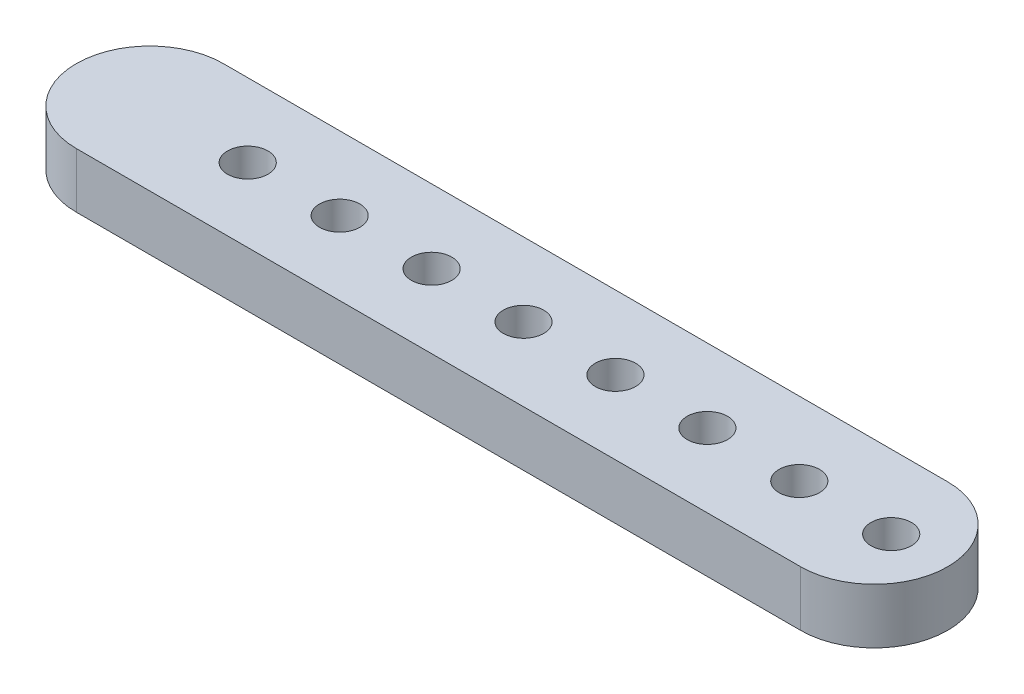
ISO-10303-21;
HEADER;
FILE_DESCRIPTION(('STEP AP214'),'2;1');
FILE_NAME('part.step','',(''),(''),'','','');
FILE_SCHEMA(('AUTOMOTIVE_DESIGN { 1 0 10303 214 1 1 1 1 }'));
ENDSEC;
DATA;
#1=APPLICATION_CONTEXT('core data for automotive mechanical design processes');
#2=APPLICATION_PROTOCOL_DEFINITION('international standard','automotive_design',2000,#1);
#3=PRODUCT_CONTEXT('',#1,'mechanical');
#4=PRODUCT('Part','Part','',(#3));
#5=PRODUCT_RELATED_PRODUCT_CATEGORY('part','',(#4));
#6=PRODUCT_DEFINITION_FORMATION('','',#4);
#7=PRODUCT_DEFINITION_CONTEXT('part definition',#1,'design');
#8=PRODUCT_DEFINITION('design','',#6,#7);
#9=PRODUCT_DEFINITION_SHAPE('','',#8);
#10=(LENGTH_UNIT() NAMED_UNIT(*) SI_UNIT(.MILLI.,.METRE.));
#11=(NAMED_UNIT(*) PLANE_ANGLE_UNIT() SI_UNIT($,.RADIAN.));
#12=(NAMED_UNIT(*) SI_UNIT($,.STERADIAN.) SOLID_ANGLE_UNIT());
#13=UNCERTAINTY_MEASURE_WITH_UNIT(LENGTH_MEASURE(1.E-05),#10,'distance_accuracy_value','');
#14=(GEOMETRIC_REPRESENTATION_CONTEXT(3) GLOBAL_UNCERTAINTY_ASSIGNED_CONTEXT((#13)) GLOBAL_UNIT_ASSIGNED_CONTEXT((#10,
#11,#12)) REPRESENTATION_CONTEXT('',''));
#15=CARTESIAN_POINT('',(0.,0.,0.));
#16=DIRECTION('',(0.,0.,1.));
#17=DIRECTION('',(1.,0.,0.));
#18=AXIS2_PLACEMENT_3D('',#15,#16,#17);
#19=CARTESIAN_POINT('',(44.3166906363032,2.625,0.));
#20=DIRECTION('',(0.,-1.,0.));
#21=DIRECTION('',(0.,0.,-1.));
#22=AXIS2_PLACEMENT_3D('',#19,#20,#21);
#23=CYLINDRICAL_SURFACE('',#22,5.);
#24=CARTESIAN_POINT('',(44.3166906363032,-1.125,0.));
#25=DIRECTION('',(0.,1.,0.));
#26=DIRECTION('',(0.,0.,1.));
#27=AXIS2_PLACEMENT_3D('',#24,#25,#26);
#28=CIRCLE('',#27,5.);
#29=CARTESIAN_POINT('',(44.3166906363032,-1.125,-5.));
#30=VERTEX_POINT('',#29);
#31=CARTESIAN_POINT('',(44.3166906363032,-1.125,5.00000000000001));
#32=VERTEX_POINT('',#31);
#33=EDGE_CURVE('E98',#30,#32,#28,.T.);
#34=ORIENTED_EDGE('',*,*,#33,.T.);
#35=DIRECTION('',(0.,-1.,0.));
#36=VECTOR('',#35,1.);
#37=CARTESIAN_POINT('',(44.3166906363032,2.625,5.00000000000001));
#38=LINE('',#37,#36);
#39=CARTESIAN_POINT('',(44.3166906363032,2.625,5.00000000000001));
#40=VERTEX_POINT('',#39);
#41=EDGE_CURVE('E11',#40,#32,#38,.T.);
#42=ORIENTED_EDGE('',*,*,#41,.F.);
#43=CARTESIAN_POINT('',(44.3166906363032,2.625,0.));
#44=DIRECTION('',(0.,1.,0.));
#45=DIRECTION('',(0.,0.,1.));
#46=AXIS2_PLACEMENT_3D('',#43,#44,#45);
#47=CIRCLE('',#46,5.);
#48=CARTESIAN_POINT('',(44.3166906363032,2.625,-5.));
#49=VERTEX_POINT('',#48);
#50=EDGE_CURVE('E86',#49,#40,#47,.T.);
#51=ORIENTED_EDGE('',*,*,#50,.F.);
#52=DIRECTION('',(0.,-1.,0.));
#53=VECTOR('',#52,1.);
#54=CARTESIAN_POINT('',(44.3166906363032,2.625,-5.));
#55=LINE('',#54,#53);
#56=EDGE_CURVE('E94',#49,#30,#55,.T.);
#57=ORIENTED_EDGE('',*,*,#56,.T.);
#58=EDGE_LOOP('',(#34,#42,#51,#57));
#59=FACE_BOUND('',#58,.T.);
#60=ADVANCED_FACE('F35',(#59),#23,.T.);
#61=CARTESIAN_POINT('',(44.3166906363032,2.625,5.00000000000001));
#62=DIRECTION('',(0.,0.,-1.));
#63=DIRECTION('',(-1.,0.,0.));
#64=AXIS2_PLACEMENT_3D('',#61,#62,#63);
#65=PLANE('',#64);
#66=DIRECTION('',(1.,0.,0.));
#67=VECTOR('',#66,1.);
#68=CARTESIAN_POINT('',(44.3166906363032,-1.125,5.00000000000001));
#69=LINE('',#68,#67);
#70=CARTESIAN_POINT('',(93.5666906363032,-1.125,5.00000000000001));
#71=VERTEX_POINT('',#70);
#72=EDGE_CURVE('E90',#32,#71,#69,.T.);
#73=ORIENTED_EDGE('',*,*,#72,.T.);
#74=DIRECTION('',(0.,-1.,0.));
#75=VECTOR('',#74,1.);
#76=CARTESIAN_POINT('',(93.5666906363032,2.625,5.00000000000001));
#77=LINE('',#76,#75);
#78=CARTESIAN_POINT('',(93.5666906363032,2.625,5.00000000000001));
#79=VERTEX_POINT('',#78);
#80=EDGE_CURVE('E43',#79,#71,#77,.T.);
#81=ORIENTED_EDGE('',*,*,#80,.F.);
#82=DIRECTION('',(1.,0.,0.));
#83=VECTOR('',#82,1.);
#84=CARTESIAN_POINT('',(44.3166906363032,2.625,5.00000000000001));
#85=LINE('',#84,#83);
#86=EDGE_CURVE('E81',#40,#79,#85,.T.);
#87=ORIENTED_EDGE('',*,*,#86,.F.);
#88=ORIENTED_EDGE('',*,*,#41,.T.);
#89=EDGE_LOOP('',(#73,#81,#87,#88));
#90=FACE_BOUND('',#89,.T.);
#91=ADVANCED_FACE('F89',(#90),#65,.F.);
#92=CARTESIAN_POINT('',(93.5666906363032,2.625,0.));
#93=DIRECTION('',(0.,-1.,0.));
#94=DIRECTION('',(0.,0.,-1.));
#95=AXIS2_PLACEMENT_3D('',#92,#93,#94);
#96=CYLINDRICAL_SURFACE('',#95,5.);
#97=CARTESIAN_POINT('',(93.5666906363032,-1.125,0.));
#98=DIRECTION('',(0.,1.,0.));
#99=DIRECTION('',(0.,0.,1.));
#100=AXIS2_PLACEMENT_3D('',#97,#98,#99);
#101=CIRCLE('',#100,5.);
#102=CARTESIAN_POINT('',(93.5666906363032,-1.125,-5.));
#103=VERTEX_POINT('',#102);
#104=EDGE_CURVE('E68',#71,#103,#101,.T.);
#105=ORIENTED_EDGE('',*,*,#104,.T.);
#106=DIRECTION('',(0.,-1.,0.));
#107=VECTOR('',#106,1.);
#108=CARTESIAN_POINT('',(93.5666906363032,2.625,-5.));
#109=LINE('',#108,#107);
#110=CARTESIAN_POINT('',(93.5666906363032,2.625,-5.));
#111=VERTEX_POINT('',#110);
#112=EDGE_CURVE('E91',#111,#103,#109,.T.);
#113=ORIENTED_EDGE('',*,*,#112,.F.);
#114=CARTESIAN_POINT('',(93.5666906363032,2.625,0.));
#115=DIRECTION('',(0.,1.,0.));
#116=DIRECTION('',(0.,0.,1.));
#117=AXIS2_PLACEMENT_3D('',#114,#115,#116);
#118=CIRCLE('',#117,5.);
#119=EDGE_CURVE('E84',#79,#111,#118,.T.);
#120=ORIENTED_EDGE('',*,*,#119,.F.);
#121=ORIENTED_EDGE('',*,*,#80,.T.);
#122=EDGE_LOOP('',(#105,#113,#120,#121));
#123=FACE_BOUND('',#122,.T.);
#124=ADVANCED_FACE('F92',(#123),#96,.T.);
#125=CARTESIAN_POINT('',(44.3166906363032,2.625,-5.));
#126=DIRECTION('',(0.,0.,1.));
#127=DIRECTION('',(1.,0.,0.));
#128=AXIS2_PLACEMENT_3D('',#125,#126,#127);
#129=PLANE('',#128);
#130=DIRECTION('',(-1.,0.,0.));
#131=VECTOR('',#130,1.);
#132=CARTESIAN_POINT('',(44.3166906363032,-1.125,-5.));
#133=LINE('',#132,#131);
#134=EDGE_CURVE('E74',#103,#30,#133,.T.);
#135=ORIENTED_EDGE('',*,*,#134,.T.);
#136=ORIENTED_EDGE('',*,*,#56,.F.);
#137=DIRECTION('',(-1.,0.,0.));
#138=VECTOR('',#137,1.);
#139=CARTESIAN_POINT('',(44.3166906363032,2.625,-5.));
#140=LINE('',#139,#138);
#141=EDGE_CURVE('E51',#111,#49,#140,.T.);
#142=ORIENTED_EDGE('',*,*,#141,.F.);
#143=ORIENTED_EDGE('',*,*,#112,.T.);
#144=EDGE_LOOP('',(#135,#136,#142,#143));
#145=FACE_BOUND('',#144,.T.);
#146=ADVANCED_FACE('F106',(#145),#129,.F.);
#147=CARTESIAN_POINT('',(44.3166906363032,2.625,0.));
#148=DIRECTION('',(0.,1.,0.));
#149=DIRECTION('',(0.,0.,1.));
#150=AXIS2_PLACEMENT_3D('',#147,#148,#149);
#151=PLANE('',#150);
#152=CARTESIAN_POINT('',(50.9743559114505,2.625,3.13609725416559E-13));
#153=DIRECTION('',(0.,1.,0.));
#154=DIRECTION('',(0.,0.,1.));
#155=AXIS2_PLACEMENT_3D('',#152,#153,#154);
#156=CIRCLE('',#155,1.37499999999999);
#157=CARTESIAN_POINT('',(50.9743559114505,2.625,1.3750000000003));
#158=VERTEX_POINT('',#157);
#159=EDGE_CURVE('E154',#158,#158,#156,.T.);
#160=ORIENTED_EDGE('',*,*,#159,.F.);
#161=EDGE_LOOP('',(#160));
#162=FACE_BOUND('',#161,.T.);
#163=CARTESIAN_POINT('',(57.2243559114505,2.625,2.6996620868102E-13));
#164=DIRECTION('',(0.,1.,0.));
#165=DIRECTION('',(0.,0.,1.));
#166=AXIS2_PLACEMENT_3D('',#163,#164,#165);
#167=CIRCLE('',#166,1.37499999999999);
#168=CARTESIAN_POINT('',(57.2243559114505,2.625,1.37500000000026));
#169=VERTEX_POINT('',#168);
#170=EDGE_CURVE('E148',#169,#169,#167,.T.);
#171=ORIENTED_EDGE('',*,*,#170,.F.);
#172=EDGE_LOOP('',(#171));
#173=FACE_BOUND('',#172,.T.);
#174=CARTESIAN_POINT('',(63.4743559114505,2.625,2.26322691945481E-13));
#175=DIRECTION('',(0.,1.,0.));
#176=DIRECTION('',(0.,0.,1.));
#177=AXIS2_PLACEMENT_3D('',#174,#175,#176);
#178=CIRCLE('',#177,1.37499999999999);
#179=CARTESIAN_POINT('',(63.4743559114505,2.625,1.37500000000022));
#180=VERTEX_POINT('',#179);
#181=EDGE_CURVE('E142',#180,#180,#178,.T.);
#182=ORIENTED_EDGE('',*,*,#181,.F.);
#183=EDGE_LOOP('',(#182));
#184=FACE_BOUND('',#183,.T.);
#185=CARTESIAN_POINT('',(69.7243559114505,2.625,1.82679175209942E-13));
#186=DIRECTION('',(0.,1.,0.));
#187=DIRECTION('',(0.,0.,1.));
#188=AXIS2_PLACEMENT_3D('',#185,#186,#187);
#189=CIRCLE('',#188,1.37499999999999);
#190=CARTESIAN_POINT('',(69.7243559114505,2.625,1.37500000000017));
#191=VERTEX_POINT('',#190);
#192=EDGE_CURVE('E136',#191,#191,#189,.T.);
#193=ORIENTED_EDGE('',*,*,#192,.F.);
#194=EDGE_LOOP('',(#193));
#195=FACE_BOUND('',#194,.T.);
#196=CARTESIAN_POINT('',(75.9743559114504,2.625,1.39035658474403E-13));
#197=DIRECTION('',(0.,1.,0.));
#198=DIRECTION('',(0.,0.,1.));
#199=AXIS2_PLACEMENT_3D('',#196,#197,#198);
#200=CIRCLE('',#199,1.37499999999999);
#201=CARTESIAN_POINT('',(75.9743559114504,2.625,1.37500000000013));
#202=VERTEX_POINT('',#201);
#203=EDGE_CURVE('E130',#202,#202,#200,.T.);
#204=ORIENTED_EDGE('',*,*,#203,.F.);
#205=EDGE_LOOP('',(#204));
#206=FACE_BOUND('',#205,.T.);
#207=CARTESIAN_POINT('',(82.2243559114504,2.625,0.));
#208=DIRECTION('',(0.,1.,0.));
#209=DIRECTION('',(0.,0.,1.));
#210=AXIS2_PLACEMENT_3D('',#207,#208,#209);
#211=CIRCLE('',#210,1.37499999999999);
#212=CARTESIAN_POINT('',(82.2243559114504,2.625,1.37500000000009));
#213=VERTEX_POINT('',#212);
#214=EDGE_CURVE('E124',#213,#213,#211,.T.);
#215=ORIENTED_EDGE('',*,*,#214,.F.);
#216=EDGE_LOOP('',(#215));
#217=FACE_BOUND('',#216,.T.);
#218=CARTESIAN_POINT('',(88.4743559114504,2.625,0.));
#219=DIRECTION('',(0.,1.,0.));
#220=DIRECTION('',(0.,0.,1.));
#221=AXIS2_PLACEMENT_3D('',#218,#219,#220);
#222=CIRCLE('',#221,1.37499999999999);
#223=CARTESIAN_POINT('',(88.4743559114504,2.625,1.37500000000004));
#224=VERTEX_POINT('',#223);
#225=EDGE_CURVE('E118',#224,#224,#222,.T.);
#226=ORIENTED_EDGE('',*,*,#225,.F.);
#227=EDGE_LOOP('',(#226));
#228=FACE_BOUND('',#227,.T.);
#229=CARTESIAN_POINT('',(94.7243559114505,2.625,0.));
#230=DIRECTION('',(0.,1.,0.));
#231=DIRECTION('',(0.,0.,1.));
#232=AXIS2_PLACEMENT_3D('',#229,#230,#231);
#233=CIRCLE('',#232,1.37499999999999);
#234=CARTESIAN_POINT('',(94.7243559114505,2.625,1.375));
#235=VERTEX_POINT('',#234);
#236=EDGE_CURVE('E112',#235,#235,#233,.T.);
#237=ORIENTED_EDGE('',*,*,#236,.F.);
#238=EDGE_LOOP('',(#237));
#239=FACE_BOUND('',#238,.T.);
#240=ORIENTED_EDGE('',*,*,#50,.T.);
#241=ORIENTED_EDGE('',*,*,#86,.T.);
#242=ORIENTED_EDGE('',*,*,#119,.T.);
#243=ORIENTED_EDGE('',*,*,#141,.T.);
#244=EDGE_LOOP('',(#240,#241,#242,#243));
#245=FACE_BOUND('',#244,.T.);
#246=ADVANCED_FACE('F82',(#162,#173,#184,#195,#206,#217,#228,#239,#245),#151,.T.);
#247=CARTESIAN_POINT('',(44.3166906363032,-1.125,0.));
#248=DIRECTION('',(0.,1.,0.));
#249=DIRECTION('',(0.,0.,1.));
#250=AXIS2_PLACEMENT_3D('',#247,#248,#249);
#251=PLANE('',#250);
#252=CARTESIAN_POINT('',(50.9743559114505,-1.125,3.13609725416559E-13));
#253=DIRECTION('',(0.,1.,0.));
#254=DIRECTION('',(0.,0.,1.));
#255=AXIS2_PLACEMENT_3D('',#252,#253,#254);
#256=CIRCLE('',#255,1.37499999999999);
#257=CARTESIAN_POINT('',(50.9743559114505,-1.125,1.3750000000003));
#258=VERTEX_POINT('',#257);
#259=EDGE_CURVE('E151',#258,#258,#256,.T.);
#260=ORIENTED_EDGE('',*,*,#259,.T.);
#261=EDGE_LOOP('',(#260));
#262=FACE_BOUND('',#261,.T.);
#263=CARTESIAN_POINT('',(57.2243559114505,-1.125,2.6996620868102E-13));
#264=DIRECTION('',(0.,1.,0.));
#265=DIRECTION('',(0.,0.,1.));
#266=AXIS2_PLACEMENT_3D('',#263,#264,#265);
#267=CIRCLE('',#266,1.37499999999999);
#268=CARTESIAN_POINT('',(57.2243559114505,-1.125,1.37500000000026));
#269=VERTEX_POINT('',#268);
#270=EDGE_CURVE('E145',#269,#269,#267,.T.);
#271=ORIENTED_EDGE('',*,*,#270,.T.);
#272=EDGE_LOOP('',(#271));
#273=FACE_BOUND('',#272,.T.);
#274=CARTESIAN_POINT('',(63.4743559114505,-1.125,2.26322691945481E-13));
#275=DIRECTION('',(0.,1.,0.));
#276=DIRECTION('',(0.,0.,1.));
#277=AXIS2_PLACEMENT_3D('',#274,#275,#276);
#278=CIRCLE('',#277,1.37499999999999);
#279=CARTESIAN_POINT('',(63.4743559114505,-1.125,1.37500000000022));
#280=VERTEX_POINT('',#279);
#281=EDGE_CURVE('E139',#280,#280,#278,.T.);
#282=ORIENTED_EDGE('',*,*,#281,.T.);
#283=EDGE_LOOP('',(#282));
#284=FACE_BOUND('',#283,.T.);
#285=CARTESIAN_POINT('',(69.7243559114505,-1.125,1.82679175209942E-13));
#286=DIRECTION('',(0.,1.,0.));
#287=DIRECTION('',(0.,0.,1.));
#288=AXIS2_PLACEMENT_3D('',#285,#286,#287);
#289=CIRCLE('',#288,1.37499999999999);
#290=CARTESIAN_POINT('',(69.7243559114505,-1.125,1.37500000000017));
#291=VERTEX_POINT('',#290);
#292=EDGE_CURVE('E133',#291,#291,#289,.T.);
#293=ORIENTED_EDGE('',*,*,#292,.T.);
#294=EDGE_LOOP('',(#293));
#295=FACE_BOUND('',#294,.T.);
#296=CARTESIAN_POINT('',(75.9743559114504,-1.125,1.39035658474403E-13));
#297=DIRECTION('',(0.,1.,0.));
#298=DIRECTION('',(0.,0.,1.));
#299=AXIS2_PLACEMENT_3D('',#296,#297,#298);
#300=CIRCLE('',#299,1.37499999999999);
#301=CARTESIAN_POINT('',(75.9743559114504,-1.125,1.37500000000013));
#302=VERTEX_POINT('',#301);
#303=EDGE_CURVE('E127',#302,#302,#300,.T.);
#304=ORIENTED_EDGE('',*,*,#303,.T.);
#305=EDGE_LOOP('',(#304));
#306=FACE_BOUND('',#305,.T.);
#307=CARTESIAN_POINT('',(82.2243559114504,-1.125,0.));
#308=DIRECTION('',(0.,1.,0.));
#309=DIRECTION('',(0.,0.,1.));
#310=AXIS2_PLACEMENT_3D('',#307,#308,#309);
#311=CIRCLE('',#310,1.37499999999999);
#312=CARTESIAN_POINT('',(82.2243559114504,-1.125,1.37500000000009));
#313=VERTEX_POINT('',#312);
#314=EDGE_CURVE('E121',#313,#313,#311,.T.);
#315=ORIENTED_EDGE('',*,*,#314,.T.);
#316=EDGE_LOOP('',(#315));
#317=FACE_BOUND('',#316,.T.);
#318=CARTESIAN_POINT('',(88.4743559114504,-1.125,0.));
#319=DIRECTION('',(0.,1.,0.));
#320=DIRECTION('',(0.,0.,1.));
#321=AXIS2_PLACEMENT_3D('',#318,#319,#320);
#322=CIRCLE('',#321,1.37499999999999);
#323=CARTESIAN_POINT('',(88.4743559114504,-1.125,1.37500000000004));
#324=VERTEX_POINT('',#323);
#325=EDGE_CURVE('E115',#324,#324,#322,.T.);
#326=ORIENTED_EDGE('',*,*,#325,.T.);
#327=EDGE_LOOP('',(#326));
#328=FACE_BOUND('',#327,.T.);
#329=CARTESIAN_POINT('',(94.7243559114505,-1.125,0.));
#330=DIRECTION('',(0.,1.,0.));
#331=DIRECTION('',(0.,0.,1.));
#332=AXIS2_PLACEMENT_3D('',#329,#330,#331);
#333=CIRCLE('',#332,1.37499999999999);
#334=CARTESIAN_POINT('',(94.7243559114505,-1.125,1.375));
#335=VERTEX_POINT('',#334);
#336=EDGE_CURVE('E101',#335,#335,#333,.T.);
#337=ORIENTED_EDGE('',*,*,#336,.T.);
#338=EDGE_LOOP('',(#337));
#339=FACE_BOUND('',#338,.T.);
#340=ORIENTED_EDGE('',*,*,#33,.F.);
#341=ORIENTED_EDGE('',*,*,#134,.F.);
#342=ORIENTED_EDGE('',*,*,#104,.F.);
#343=ORIENTED_EDGE('',*,*,#72,.F.);
#344=EDGE_LOOP('',(#340,#341,#342,#343));
#345=FACE_BOUND('',#344,.T.);
#346=ADVANCED_FACE('F109',(#262,#273,#284,#295,#306,#317,#328,#339,#345),#251,.F.);
#347=CARTESIAN_POINT('',(94.7243559114505,-1.125,0.));
#348=DIRECTION('',(0.,1.,0.));
#349=DIRECTION('',(0.,0.,1.));
#350=AXIS2_PLACEMENT_3D('',#347,#348,#349);
#351=CYLINDRICAL_SURFACE('',#350,1.37499999999999);
#352=ORIENTED_EDGE('',*,*,#336,.F.);
#353=EDGE_LOOP('',(#352));
#354=FACE_BOUND('',#353,.T.);
#355=ORIENTED_EDGE('',*,*,#236,.T.);
#356=EDGE_LOOP('',(#355));
#357=FACE_BOUND('',#356,.T.);
#358=ADVANCED_FACE('F186',(#354,#357),#351,.F.);
#359=CARTESIAN_POINT('',(88.4743559114504,-1.125,0.));
#360=DIRECTION('',(0.,1.,0.));
#361=DIRECTION('',(0.,0.,1.));
#362=AXIS2_PLACEMENT_3D('',#359,#360,#361);
#363=CYLINDRICAL_SURFACE('',#362,1.37499999999999);
#364=ORIENTED_EDGE('',*,*,#325,.F.);
#365=EDGE_LOOP('',(#364));
#366=FACE_BOUND('',#365,.T.);
#367=ORIENTED_EDGE('',*,*,#225,.T.);
#368=EDGE_LOOP('',(#367));
#369=FACE_BOUND('',#368,.T.);
#370=ADVANCED_FACE('F188',(#366,#369),#363,.F.);
#371=CARTESIAN_POINT('',(82.2243559114504,-1.125,0.));
#372=DIRECTION('',(0.,1.,0.));
#373=DIRECTION('',(0.,0.,1.));
#374=AXIS2_PLACEMENT_3D('',#371,#372,#373);
#375=CYLINDRICAL_SURFACE('',#374,1.37499999999999);
#376=ORIENTED_EDGE('',*,*,#314,.F.);
#377=EDGE_LOOP('',(#376));
#378=FACE_BOUND('',#377,.T.);
#379=ORIENTED_EDGE('',*,*,#214,.T.);
#380=EDGE_LOOP('',(#379));
#381=FACE_BOUND('',#380,.T.);
#382=ADVANCED_FACE('F195',(#378,#381),#375,.F.);
#383=CARTESIAN_POINT('',(75.9743559114504,-1.125,1.39035658474403E-13));
#384=DIRECTION('',(0.,1.,0.));
#385=DIRECTION('',(0.,0.,1.));
#386=AXIS2_PLACEMENT_3D('',#383,#384,#385);
#387=CYLINDRICAL_SURFACE('',#386,1.37499999999999);
#388=ORIENTED_EDGE('',*,*,#303,.F.);
#389=EDGE_LOOP('',(#388));
#390=FACE_BOUND('',#389,.T.);
#391=ORIENTED_EDGE('',*,*,#203,.T.);
#392=EDGE_LOOP('',(#391));
#393=FACE_BOUND('',#392,.T.);
#394=ADVANCED_FACE('F241',(#390,#393),#387,.F.);
#395=CARTESIAN_POINT('',(69.7243559114505,-1.125,1.82679175209942E-13));
#396=DIRECTION('',(0.,1.,0.));
#397=DIRECTION('',(0.,0.,1.));
#398=AXIS2_PLACEMENT_3D('',#395,#396,#397);
#399=CYLINDRICAL_SURFACE('',#398,1.37499999999999);
#400=ORIENTED_EDGE('',*,*,#292,.F.);
#401=EDGE_LOOP('',(#400));
#402=FACE_BOUND('',#401,.T.);
#403=ORIENTED_EDGE('',*,*,#192,.T.);
#404=EDGE_LOOP('',(#403));
#405=FACE_BOUND('',#404,.T.);
#406=ADVANCED_FACE('F251',(#402,#405),#399,.F.);
#407=CARTESIAN_POINT('',(63.4743559114505,-1.125,2.26322691945481E-13));
#408=DIRECTION('',(0.,1.,0.));
#409=DIRECTION('',(0.,0.,1.));
#410=AXIS2_PLACEMENT_3D('',#407,#408,#409);
#411=CYLINDRICAL_SURFACE('',#410,1.37499999999999);
#412=ORIENTED_EDGE('',*,*,#281,.F.);
#413=EDGE_LOOP('',(#412));
#414=FACE_BOUND('',#413,.T.);
#415=ORIENTED_EDGE('',*,*,#181,.T.);
#416=EDGE_LOOP('',(#415));
#417=FACE_BOUND('',#416,.T.);
#418=ADVANCED_FACE('F261',(#414,#417),#411,.F.);
#419=CARTESIAN_POINT('',(57.2243559114505,-1.125,2.6996620868102E-13));
#420=DIRECTION('',(0.,1.,0.));
#421=DIRECTION('',(0.,0.,1.));
#422=AXIS2_PLACEMENT_3D('',#419,#420,#421);
#423=CYLINDRICAL_SURFACE('',#422,1.37499999999999);
#424=ORIENTED_EDGE('',*,*,#270,.F.);
#425=EDGE_LOOP('',(#424));
#426=FACE_BOUND('',#425,.T.);
#427=ORIENTED_EDGE('',*,*,#170,.T.);
#428=EDGE_LOOP('',(#427));
#429=FACE_BOUND('',#428,.T.);
#430=ADVANCED_FACE('F165',(#426,#429),#423,.F.);
#431=CARTESIAN_POINT('',(50.9743559114505,-1.125,3.13609725416559E-13));
#432=DIRECTION('',(0.,1.,0.));
#433=DIRECTION('',(0.,0.,1.));
#434=AXIS2_PLACEMENT_3D('',#431,#432,#433);
#435=CYLINDRICAL_SURFACE('',#434,1.37499999999999);
#436=ORIENTED_EDGE('',*,*,#259,.F.);
#437=EDGE_LOOP('',(#436));
#438=FACE_BOUND('',#437,.T.);
#439=ORIENTED_EDGE('',*,*,#159,.T.);
#440=EDGE_LOOP('',(#439));
#441=FACE_BOUND('',#440,.T.);
#442=ADVANCED_FACE('F162',(#438,#441),#435,.F.);
#443=CLOSED_SHELL('',(#60,#91,#124,#146,#246,#346,#358,#370,#382,#394,#406,#418,#430,#442));
#444=MANIFOLD_SOLID_BREP('B2',#443);
#445=ADVANCED_BREP_SHAPE_REPRESENTATION('',(#18,#444),#14);
#446=SHAPE_DEFINITION_REPRESENTATION(#9,#445);
ENDSEC;
END-ISO-10303-21;
